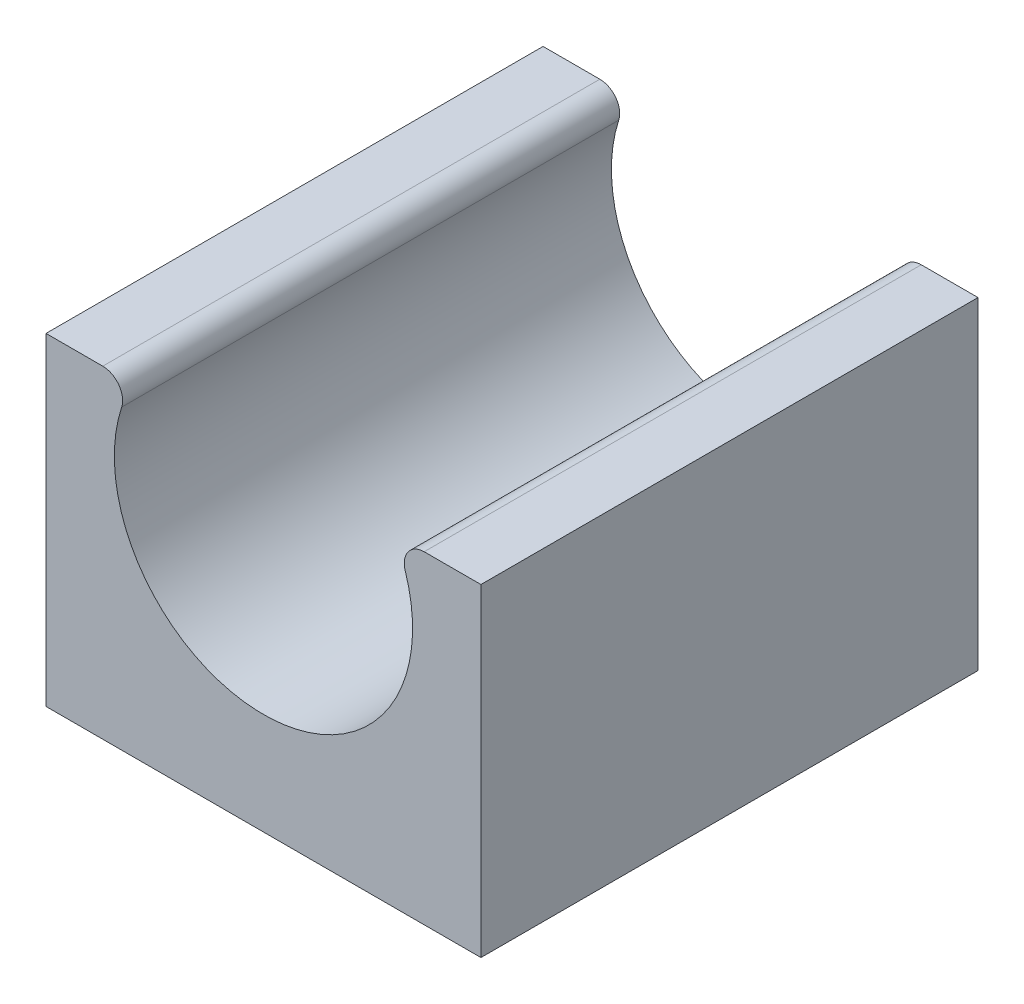
ISO-10303-21;
HEADER;
FILE_DESCRIPTION(('STEP AP214'),'2;1');
FILE_NAME('part.step','',(''),(''),'','','');
FILE_SCHEMA(('AUTOMOTIVE_DESIGN { 1 0 10303 214 1 1 1 1 }'));
ENDSEC;
DATA;
#1=APPLICATION_CONTEXT('core data for automotive mechanical design processes');
#2=APPLICATION_PROTOCOL_DEFINITION('international standard','automotive_design',2000,#1);
#3=PRODUCT_CONTEXT('',#1,'mechanical');
#4=PRODUCT('Part','Part','',(#3));
#5=PRODUCT_RELATED_PRODUCT_CATEGORY('part','',(#4));
#6=PRODUCT_DEFINITION_FORMATION('','',#4);
#7=PRODUCT_DEFINITION_CONTEXT('part definition',#1,'design');
#8=PRODUCT_DEFINITION('design','',#6,#7);
#9=PRODUCT_DEFINITION_SHAPE('','',#8);
#10=(LENGTH_UNIT() NAMED_UNIT(*) SI_UNIT(.MILLI.,.METRE.));
#11=(NAMED_UNIT(*) PLANE_ANGLE_UNIT() SI_UNIT($,.RADIAN.));
#12=(NAMED_UNIT(*) SI_UNIT($,.STERADIAN.) SOLID_ANGLE_UNIT());
#13=UNCERTAINTY_MEASURE_WITH_UNIT(LENGTH_MEASURE(1.E-05),#10,'distance_accuracy_value','');
#14=(GEOMETRIC_REPRESENTATION_CONTEXT(3) GLOBAL_UNCERTAINTY_ASSIGNED_CONTEXT((#13)) GLOBAL_UNIT_ASSIGNED_CONTEXT((#10,
#11,#12)) REPRESENTATION_CONTEXT('',''));
#15=CARTESIAN_POINT('',(0.,0.,0.));
#16=DIRECTION('',(0.,0.,1.));
#17=DIRECTION('',(1.,0.,0.));
#18=AXIS2_PLACEMENT_3D('',#15,#16,#17);
#19=CARTESIAN_POINT('',(-8.75,-6.5,20.));
#20=DIRECTION('',(1.,0.,0.));
#21=DIRECTION('',(0.,0.,-1.));
#22=AXIS2_PLACEMENT_3D('',#19,#20,#21);
#23=PLANE('',#22);
#24=DIRECTION('',(0.,-1.,0.));
#25=VECTOR('',#24,1.);
#26=CARTESIAN_POINT('',(-8.75,-6.5,0.));
#27=LINE('',#26,#25);
#28=CARTESIAN_POINT('',(-8.75,6.5,0.));
#29=VERTEX_POINT('',#28);
#30=CARTESIAN_POINT('',(-8.75,-6.5,0.));
#31=VERTEX_POINT('',#30);
#32=EDGE_CURVE('E122',#29,#31,#27,.T.);
#33=ORIENTED_EDGE('',*,*,#32,.T.);
#34=DIRECTION('',(0.,0.,-1.));
#35=VECTOR('',#34,1.);
#36=CARTESIAN_POINT('',(-8.75,-6.5,20.));
#37=LINE('',#36,#35);
#38=CARTESIAN_POINT('',(-8.75,-6.5,20.));
#39=VERTEX_POINT('',#38);
#40=EDGE_CURVE('E105',#39,#31,#37,.T.);
#41=ORIENTED_EDGE('',*,*,#40,.F.);
#42=DIRECTION('',(0.,-1.,0.));
#43=VECTOR('',#42,1.);
#44=CARTESIAN_POINT('',(-8.75,-6.5,20.));
#45=LINE('',#44,#43);
#46=CARTESIAN_POINT('',(-8.75,6.5,20.));
#47=VERTEX_POINT('',#46);
#48=EDGE_CURVE('E111',#47,#39,#45,.T.);
#49=ORIENTED_EDGE('',*,*,#48,.F.);
#50=DIRECTION('',(0.,0.,-1.));
#51=VECTOR('',#50,1.);
#52=CARTESIAN_POINT('',(-8.75,6.5,20.));
#53=LINE('',#52,#51);
#54=EDGE_CURVE('E168',#47,#29,#53,.T.);
#55=ORIENTED_EDGE('',*,*,#54,.T.);
#56=EDGE_LOOP('',(#33,#41,#49,#55));
#57=FACE_BOUND('',#56,.T.);
#58=ADVANCED_FACE('F33',(#57),#23,.F.);
#59=CARTESIAN_POINT('',(8.75,-6.5,20.));
#60=DIRECTION('',(0.,1.,0.));
#61=DIRECTION('',(-1.,0.,0.));
#62=AXIS2_PLACEMENT_3D('',#59,#60,#61);
#63=PLANE('',#62);
#64=DIRECTION('',(1.,0.,0.));
#65=VECTOR('',#64,1.);
#66=CARTESIAN_POINT('',(8.75,-6.5,0.));
#67=LINE('',#66,#65);
#68=CARTESIAN_POINT('',(8.75,-6.5,0.));
#69=VERTEX_POINT('',#68);
#70=EDGE_CURVE('E163',#31,#69,#67,.T.);
#71=ORIENTED_EDGE('',*,*,#70,.T.);
#72=DIRECTION('',(0.,0.,-1.));
#73=VECTOR('',#72,1.);
#74=CARTESIAN_POINT('',(8.75,-6.5,20.));
#75=LINE('',#74,#73);
#76=CARTESIAN_POINT('',(8.75,-6.5,20.));
#77=VERTEX_POINT('',#76);
#78=EDGE_CURVE('E108',#77,#69,#75,.T.);
#79=ORIENTED_EDGE('',*,*,#78,.F.);
#80=DIRECTION('',(1.,0.,0.));
#81=VECTOR('',#80,1.);
#82=CARTESIAN_POINT('',(8.75,-6.5,20.));
#83=LINE('',#82,#81);
#84=EDGE_CURVE('E101',#39,#77,#83,.T.);
#85=ORIENTED_EDGE('',*,*,#84,.F.);
#86=ORIENTED_EDGE('',*,*,#40,.T.);
#87=EDGE_LOOP('',(#71,#79,#85,#86));
#88=FACE_BOUND('',#87,.T.);
#89=ADVANCED_FACE('F103',(#88),#63,.F.);
#90=CARTESIAN_POINT('',(8.75,-6.5,20.));
#91=DIRECTION('',(-1.,0.,0.));
#92=DIRECTION('',(0.,0.,1.));
#93=AXIS2_PLACEMENT_3D('',#90,#91,#92);
#94=PLANE('',#93);
#95=DIRECTION('',(0.,1.,0.));
#96=VECTOR('',#95,1.);
#97=CARTESIAN_POINT('',(8.75,-6.5,0.));
#98=LINE('',#97,#96);
#99=CARTESIAN_POINT('',(8.75,6.5,0.));
#100=VERTEX_POINT('',#99);
#101=EDGE_CURVE('E160',#69,#100,#98,.T.);
#102=ORIENTED_EDGE('',*,*,#101,.T.);
#103=DIRECTION('',(0.,0.,-1.));
#104=VECTOR('',#103,1.);
#105=CARTESIAN_POINT('',(8.75,6.5,20.));
#106=LINE('',#105,#104);
#107=CARTESIAN_POINT('',(8.75,6.5,20.));
#108=VERTEX_POINT('',#107);
#109=EDGE_CURVE('E127',#108,#100,#106,.T.);
#110=ORIENTED_EDGE('',*,*,#109,.F.);
#111=DIRECTION('',(0.,1.,0.));
#112=VECTOR('',#111,1.);
#113=CARTESIAN_POINT('',(8.75,-6.5,20.));
#114=LINE('',#113,#112);
#115=EDGE_CURVE('E110',#77,#108,#114,.T.);
#116=ORIENTED_EDGE('',*,*,#115,.F.);
#117=ORIENTED_EDGE('',*,*,#78,.T.);
#118=EDGE_LOOP('',(#102,#110,#116,#117));
#119=FACE_BOUND('',#118,.T.);
#120=ADVANCED_FACE('F173',(#119),#94,.F.);
#121=CARTESIAN_POINT('',(8.75,6.5,20.));
#122=DIRECTION('',(0.,-1.,0.));
#123=DIRECTION('',(0.,0.,-1.));
#124=AXIS2_PLACEMENT_3D('',#121,#122,#123);
#125=PLANE('',#124);
#126=DIRECTION('',(-1.,0.,0.));
#127=VECTOR('',#126,1.);
#128=CARTESIAN_POINT('',(8.75,6.5,0.));
#129=LINE('',#128,#127);
#130=CARTESIAN_POINT('',(6.46607145146486,6.5,0.));
#131=VERTEX_POINT('',#130);
#132=EDGE_CURVE('E155',#100,#131,#129,.T.);
#133=ORIENTED_EDGE('',*,*,#132,.T.);
#134=DIRECTION('',(0.,0.,-1.));
#135=VECTOR('',#134,1.);
#136=CARTESIAN_POINT('',(6.46607145146486,6.5,20.));
#137=LINE('',#136,#135);
#138=CARTESIAN_POINT('',(6.46607145146486,6.5,20.));
#139=VERTEX_POINT('',#138);
#140=EDGE_CURVE('E56',#131,#139,#137,.F.);
#141=ORIENTED_EDGE('',*,*,#140,.T.);
#142=DIRECTION('',(-1.,0.,0.));
#143=VECTOR('',#142,1.);
#144=CARTESIAN_POINT('',(8.75,6.5,20.));
#145=LINE('',#144,#143);
#146=EDGE_CURVE('E141',#108,#139,#145,.T.);
#147=ORIENTED_EDGE('',*,*,#146,.F.);
#148=ORIENTED_EDGE('',*,*,#109,.T.);
#149=EDGE_LOOP('',(#133,#141,#147,#148));
#150=FACE_BOUND('',#149,.T.);
#151=ADVANCED_FACE('F158',(#150),#125,.F.);
#152=CARTESIAN_POINT('',(0.,3.59526249034444,20.));
#153=DIRECTION('',(0.,0.,-1.));
#154=DIRECTION('',(-1.,0.,0.));
#155=AXIS2_PLACEMENT_3D('',#152,#153,#154);
#156=CYLINDRICAL_SURFACE('',#155,6.);
#157=CARTESIAN_POINT('',(0.,3.59526249034444,20.));
#158=DIRECTION('',(0.,0.,-1.));
#159=DIRECTION('',(1.,0.,0.));
#160=AXIS2_PLACEMENT_3D('',#157,#158,#159);
#161=CIRCLE('',#160,6.);
#162=CARTESIAN_POINT('',(5.70535716305723,5.45238382239346,20.));
#163=VERTEX_POINT('',#162);
#164=CARTESIAN_POINT('',(-5.70535716305723,5.45238382239346,20.));
#165=VERTEX_POINT('',#164);
#166=EDGE_CURVE('E140',#163,#165,#161,.T.);
#167=ORIENTED_EDGE('',*,*,#166,.F.);
#168=DIRECTION('',(0.,0.,-1.));
#169=VECTOR('',#168,1.);
#170=CARTESIAN_POINT('',(5.70535716305723,5.45238382239346,20.));
#171=LINE('',#170,#169);
#172=CARTESIAN_POINT('',(5.70535716305723,5.45238382239346,0.));
#173=VERTEX_POINT('',#172);
#174=EDGE_CURVE('E125',#163,#173,#171,.T.);
#175=ORIENTED_EDGE('',*,*,#174,.T.);
#176=CARTESIAN_POINT('',(0.,3.59526249034444,0.));
#177=DIRECTION('',(0.,0.,-1.));
#178=DIRECTION('',(1.,0.,0.));
#179=AXIS2_PLACEMENT_3D('',#176,#177,#178);
#180=CIRCLE('',#179,6.);
#181=CARTESIAN_POINT('',(-5.70535716305723,5.45238382239346,0.));
#182=VERTEX_POINT('',#181);
#183=EDGE_CURVE('E156',#173,#182,#180,.T.);
#184=ORIENTED_EDGE('',*,*,#183,.T.);
#185=DIRECTION('',(0.,0.,-1.));
#186=VECTOR('',#185,1.);
#187=CARTESIAN_POINT('',(-5.70535716305723,5.45238382239346,20.));
#188=LINE('',#187,#186);
#189=EDGE_CURVE('E123',#182,#165,#188,.F.);
#190=ORIENTED_EDGE('',*,*,#189,.T.);
#191=EDGE_LOOP('',(#167,#175,#184,#190));
#192=FACE_BOUND('',#191,.T.);
#193=ADVANCED_FACE('F145',(#192),#156,.F.);
#194=CARTESIAN_POINT('',(-5.25,6.5,20.));
#195=DIRECTION('',(0.,-1.,0.));
#196=DIRECTION('',(1.,0.,0.));
#197=AXIS2_PLACEMENT_3D('',#194,#195,#196);
#198=PLANE('',#197);
#199=DIRECTION('',(-1.,0.,0.));
#200=VECTOR('',#199,1.);
#201=CARTESIAN_POINT('',(-5.25,6.5,20.));
#202=LINE('',#201,#200);
#203=CARTESIAN_POINT('',(-6.46607145146486,6.5,20.));
#204=VERTEX_POINT('',#203);
#205=EDGE_CURVE('E115',#204,#47,#202,.T.);
#206=ORIENTED_EDGE('',*,*,#205,.F.);
#207=DIRECTION('',(0.,0.,-1.));
#208=VECTOR('',#207,1.);
#209=CARTESIAN_POINT('',(-6.46607145146486,6.5,20.));
#210=LINE('',#209,#208);
#211=CARTESIAN_POINT('',(-6.46607145146486,6.5,0.));
#212=VERTEX_POINT('',#211);
#213=EDGE_CURVE('E11',#204,#212,#210,.T.);
#214=ORIENTED_EDGE('',*,*,#213,.T.);
#215=DIRECTION('',(-1.,0.,0.));
#216=VECTOR('',#215,1.);
#217=CARTESIAN_POINT('',(-5.25,6.5,0.));
#218=LINE('',#217,#216);
#219=EDGE_CURVE('E119',#212,#29,#218,.T.);
#220=ORIENTED_EDGE('',*,*,#219,.T.);
#221=ORIENTED_EDGE('',*,*,#54,.F.);
#222=EDGE_LOOP('',(#206,#214,#220,#221));
#223=FACE_BOUND('',#222,.T.);
#224=ADVANCED_FACE('F197',(#223),#198,.F.);
#225=CARTESIAN_POINT('',(0.,3.59526249034444,20.));
#226=DIRECTION('',(0.,0.,1.));
#227=DIRECTION('',(1.,0.,0.));
#228=AXIS2_PLACEMENT_3D('',#225,#226,#227);
#229=PLANE('',#228);
#230=ORIENTED_EDGE('',*,*,#146,.T.);
#231=CARTESIAN_POINT('',(6.46607145146486,5.7,20.));
#232=DIRECTION('',(0.,0.,1.));
#233=DIRECTION('',(1.,0.,0.));
#234=AXIS2_PLACEMENT_3D('',#231,#232,#233);
#235=CIRCLE('',#234,0.8);
#236=EDGE_CURVE('E41',#139,#163,#235,.T.);
#237=ORIENTED_EDGE('',*,*,#236,.T.);
#238=ORIENTED_EDGE('',*,*,#166,.T.);
#239=CARTESIAN_POINT('',(-6.46607145146486,5.7,20.));
#240=DIRECTION('',(0.,0.,1.));
#241=DIRECTION('',(1.,0.,0.));
#242=AXIS2_PLACEMENT_3D('',#239,#240,#241);
#243=CIRCLE('',#242,0.8);
#244=EDGE_CURVE('E48',#165,#204,#243,.T.);
#245=ORIENTED_EDGE('',*,*,#244,.T.);
#246=ORIENTED_EDGE('',*,*,#205,.T.);
#247=ORIENTED_EDGE('',*,*,#48,.T.);
#248=ORIENTED_EDGE('',*,*,#84,.T.);
#249=ORIENTED_EDGE('',*,*,#115,.T.);
#250=EDGE_LOOP('',(#230,#237,#238,#245,#246,#247,#248,#249));
#251=FACE_BOUND('',#250,.T.);
#252=ADVANCED_FACE('F114',(#251),#229,.T.);
#253=CARTESIAN_POINT('',(0.,3.59526249034444,0.));
#254=DIRECTION('',(0.,0.,1.));
#255=DIRECTION('',(1.,0.,0.));
#256=AXIS2_PLACEMENT_3D('',#253,#254,#255);
#257=PLANE('',#256);
#258=ORIENTED_EDGE('',*,*,#183,.F.);
#259=CARTESIAN_POINT('',(6.46607145146486,5.7,0.));
#260=DIRECTION('',(0.,0.,1.));
#261=DIRECTION('',(1.,0.,0.));
#262=AXIS2_PLACEMENT_3D('',#259,#260,#261);
#263=CIRCLE('',#262,0.8);
#264=EDGE_CURVE('E135',#173,#131,#263,.F.);
#265=ORIENTED_EDGE('',*,*,#264,.T.);
#266=ORIENTED_EDGE('',*,*,#132,.F.);
#267=ORIENTED_EDGE('',*,*,#101,.F.);
#268=ORIENTED_EDGE('',*,*,#70,.F.);
#269=ORIENTED_EDGE('',*,*,#32,.F.);
#270=ORIENTED_EDGE('',*,*,#219,.F.);
#271=CARTESIAN_POINT('',(-6.46607145146486,5.7,0.));
#272=DIRECTION('',(0.,0.,1.));
#273=DIRECTION('',(1.,0.,0.));
#274=AXIS2_PLACEMENT_3D('',#271,#272,#273);
#275=CIRCLE('',#274,0.8);
#276=EDGE_CURVE('E133',#212,#182,#275,.F.);
#277=ORIENTED_EDGE('',*,*,#276,.T.);
#278=EDGE_LOOP('',(#258,#265,#266,#267,#268,#269,#270,#277));
#279=FACE_BOUND('',#278,.T.);
#280=ADVANCED_FACE('F153',(#279),#257,.F.);
#281=CARTESIAN_POINT('',(6.46607145146486,5.7,20.));
#282=DIRECTION('',(0.,0.,-1.));
#283=DIRECTION('',(-1.,0.,0.));
#284=AXIS2_PLACEMENT_3D('',#281,#282,#283);
#285=CYLINDRICAL_SURFACE('',#284,0.8);
#286=ORIENTED_EDGE('',*,*,#236,.F.);
#287=ORIENTED_EDGE('',*,*,#140,.F.);
#288=ORIENTED_EDGE('',*,*,#264,.F.);
#289=ORIENTED_EDGE('',*,*,#174,.F.);
#290=EDGE_LOOP('',(#286,#287,#288,#289));
#291=FACE_BOUND('',#290,.T.);
#292=ADVANCED_FACE('F150',(#291),#285,.T.);
#293=CARTESIAN_POINT('',(-6.46607145146486,5.7,20.));
#294=DIRECTION('',(0.,0.,-1.));
#295=DIRECTION('',(-1.,0.,0.));
#296=AXIS2_PLACEMENT_3D('',#293,#294,#295);
#297=CYLINDRICAL_SURFACE('',#296,0.8);
#298=ORIENTED_EDGE('',*,*,#244,.F.);
#299=ORIENTED_EDGE('',*,*,#189,.F.);
#300=ORIENTED_EDGE('',*,*,#276,.F.);
#301=ORIENTED_EDGE('',*,*,#213,.F.);
#302=EDGE_LOOP('',(#298,#299,#300,#301));
#303=FACE_BOUND('',#302,.T.);
#304=ADVANCED_FACE('F35',(#303),#297,.T.);
#305=CLOSED_SHELL('',(#58,#89,#120,#151,#193,#224,#252,#280,#292,#304));
#306=MANIFOLD_SOLID_BREP('B2',#305);
#307=ADVANCED_BREP_SHAPE_REPRESENTATION('',(#18,#306),#14);
#308=SHAPE_DEFINITION_REPRESENTATION(#9,#307);
ENDSEC;
END-ISO-10303-21;
